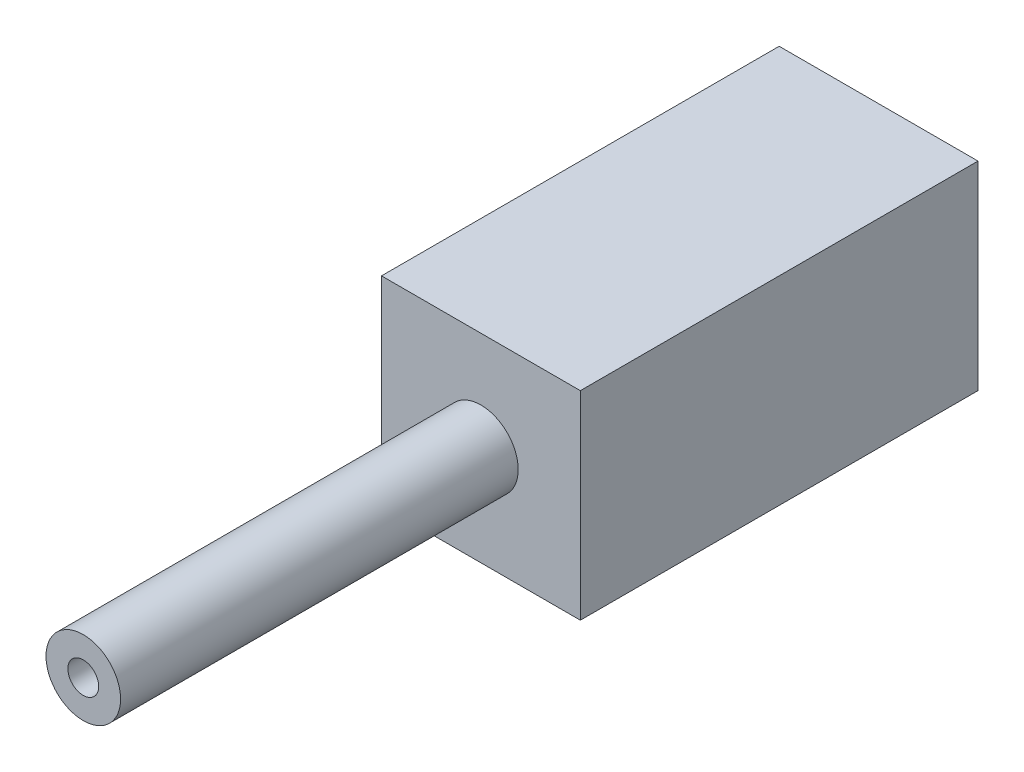
ISO-10303-21;
HEADER;
FILE_DESCRIPTION(('STEP AP214'),'2;1');
FILE_NAME('part.step','',(''),(''),'','','');
FILE_SCHEMA(('AUTOMOTIVE_DESIGN { 1 0 10303 214 1 1 1 1 }'));
ENDSEC;
DATA;
#1=APPLICATION_CONTEXT('core data for automotive mechanical design processes');
#2=APPLICATION_PROTOCOL_DEFINITION('international standard','automotive_design',2000,#1);
#3=PRODUCT_CONTEXT('',#1,'mechanical');
#4=PRODUCT('Part','Part','',(#3));
#5=PRODUCT_RELATED_PRODUCT_CATEGORY('part','',(#4));
#6=PRODUCT_DEFINITION_FORMATION('','',#4);
#7=PRODUCT_DEFINITION_CONTEXT('part definition',#1,'design');
#8=PRODUCT_DEFINITION('design','',#6,#7);
#9=PRODUCT_DEFINITION_SHAPE('','',#8);
#10=(LENGTH_UNIT() NAMED_UNIT(*) SI_UNIT(.MILLI.,.METRE.));
#11=(NAMED_UNIT(*) PLANE_ANGLE_UNIT() SI_UNIT($,.RADIAN.));
#12=(NAMED_UNIT(*) SI_UNIT($,.STERADIAN.) SOLID_ANGLE_UNIT());
#13=UNCERTAINTY_MEASURE_WITH_UNIT(LENGTH_MEASURE(1.E-05),#10,'distance_accuracy_value','');
#14=(GEOMETRIC_REPRESENTATION_CONTEXT(3) GLOBAL_UNCERTAINTY_ASSIGNED_CONTEXT((#13)) GLOBAL_UNIT_ASSIGNED_CONTEXT((#10,
#11,#12)) REPRESENTATION_CONTEXT('',''));
#15=CARTESIAN_POINT('',(0.,0.,0.));
#16=DIRECTION('',(0.,0.,1.));
#17=DIRECTION('',(1.,0.,0.));
#18=AXIS2_PLACEMENT_3D('',#15,#16,#17);
#19=CARTESIAN_POINT('',(0.,0.,40.));
#20=DIRECTION('',(0.,0.,-1.));
#21=DIRECTION('',(-1.,0.,0.));
#22=AXIS2_PLACEMENT_3D('',#19,#20,#21);
#23=PLANE('',#22);
#24=DIRECTION('',(0.,1.,0.));
#25=VECTOR('',#24,1.);
#26=CARTESIAN_POINT('',(10.,-10.,40.));
#27=LINE('',#26,#25);
#28=CARTESIAN_POINT('',(10.,-10.,40.));
#29=VERTEX_POINT('',#28);
#30=CARTESIAN_POINT('',(10.,10.,40.));
#31=VERTEX_POINT('',#30);
#32=EDGE_CURVE('E86',#29,#31,#27,.T.);
#33=ORIENTED_EDGE('',*,*,#32,.T.);
#34=DIRECTION('',(-1.,0.,0.));
#35=VECTOR('',#34,1.);
#36=CARTESIAN_POINT('',(-10.,10.,40.));
#37=LINE('',#36,#35);
#38=CARTESIAN_POINT('',(-10.,10.,40.));
#39=VERTEX_POINT('',#38);
#40=EDGE_CURVE('E81',#31,#39,#37,.T.);
#41=ORIENTED_EDGE('',*,*,#40,.T.);
#42=DIRECTION('',(0.,-1.,0.));
#43=VECTOR('',#42,1.);
#44=CARTESIAN_POINT('',(-10.,-10.,40.));
#45=LINE('',#44,#43);
#46=CARTESIAN_POINT('',(-10.,-10.,40.));
#47=VERTEX_POINT('',#46);
#48=EDGE_CURVE('E84',#39,#47,#45,.T.);
#49=ORIENTED_EDGE('',*,*,#48,.T.);
#50=DIRECTION('',(1.,0.,0.));
#51=VECTOR('',#50,1.);
#52=CARTESIAN_POINT('',(-10.,-10.,40.));
#53=LINE('',#52,#51);
#54=EDGE_CURVE('E50',#47,#29,#53,.T.);
#55=ORIENTED_EDGE('',*,*,#54,.T.);
#56=EDGE_LOOP('',(#33,#41,#49,#55));
#57=FACE_BOUND('',#56,.T.);
#58=CARTESIAN_POINT('',(0.,0.,40.));
#59=DIRECTION('',(0.,0.,-1.));
#60=DIRECTION('',(-1.,0.,0.));
#61=AXIS2_PLACEMENT_3D('',#58,#59,#60);
#62=CIRCLE('',#61,3.75);
#63=CARTESIAN_POINT('',(-3.75,0.,40.));
#64=VERTEX_POINT('',#63);
#65=EDGE_CURVE('E11',#64,#64,#62,.F.);
#66=ORIENTED_EDGE('',*,*,#65,.F.);
#67=EDGE_LOOP('',(#66));
#68=FACE_BOUND('',#67,.T.);
#69=ADVANCED_FACE('F33',(#57,#68),#23,.F.);
#70=CARTESIAN_POINT('',(0.,0.,0.));
#71=DIRECTION('',(0.,0.,-1.));
#72=DIRECTION('',(-1.,0.,0.));
#73=AXIS2_PLACEMENT_3D('',#70,#71,#72);
#74=PLANE('',#73);
#75=DIRECTION('',(0.,1.,0.));
#76=VECTOR('',#75,1.);
#77=CARTESIAN_POINT('',(10.,-10.,0.));
#78=LINE('',#77,#76);
#79=CARTESIAN_POINT('',(10.,-10.,0.));
#80=VERTEX_POINT('',#79);
#81=CARTESIAN_POINT('',(10.,10.,0.));
#82=VERTEX_POINT('',#81);
#83=EDGE_CURVE('E100',#80,#82,#78,.T.);
#84=ORIENTED_EDGE('',*,*,#83,.F.);
#85=DIRECTION('',(1.,0.,0.));
#86=VECTOR('',#85,1.);
#87=CARTESIAN_POINT('',(-10.,-10.,0.));
#88=LINE('',#87,#86);
#89=CARTESIAN_POINT('',(-10.,-10.,0.));
#90=VERTEX_POINT('',#89);
#91=EDGE_CURVE('E73',#90,#80,#88,.T.);
#92=ORIENTED_EDGE('',*,*,#91,.F.);
#93=DIRECTION('',(0.,-1.,0.));
#94=VECTOR('',#93,1.);
#95=CARTESIAN_POINT('',(-10.,-10.,0.));
#96=LINE('',#95,#94);
#97=CARTESIAN_POINT('',(-10.,10.,0.));
#98=VERTEX_POINT('',#97);
#99=EDGE_CURVE('E67',#98,#90,#96,.T.);
#100=ORIENTED_EDGE('',*,*,#99,.F.);
#101=DIRECTION('',(-1.,0.,0.));
#102=VECTOR('',#101,1.);
#103=CARTESIAN_POINT('',(-10.,10.,0.));
#104=LINE('',#103,#102);
#105=EDGE_CURVE('E91',#82,#98,#104,.T.);
#106=ORIENTED_EDGE('',*,*,#105,.F.);
#107=EDGE_LOOP('',(#84,#92,#100,#106));
#108=FACE_BOUND('',#107,.T.);
#109=CARTESIAN_POINT('',(0.,0.,0.));
#110=DIRECTION('',(0.,0.,1.));
#111=DIRECTION('',(1.,0.,0.));
#112=AXIS2_PLACEMENT_3D('',#109,#110,#111);
#113=CIRCLE('',#112,1.55);
#114=CARTESIAN_POINT('',(1.55,0.,0.));
#115=VERTEX_POINT('',#114);
#116=EDGE_CURVE('E103',#115,#115,#113,.T.);
#117=ORIENTED_EDGE('',*,*,#116,.T.);
#118=EDGE_LOOP('',(#117));
#119=FACE_BOUND('',#118,.T.);
#120=ADVANCED_FACE('F111',(#108,#119),#74,.T.);
#121=CARTESIAN_POINT('',(10.,-10.,40.));
#122=DIRECTION('',(-1.,0.,0.));
#123=DIRECTION('',(0.,0.,1.));
#124=AXIS2_PLACEMENT_3D('',#121,#122,#123);
#125=PLANE('',#124);
#126=ORIENTED_EDGE('',*,*,#83,.T.);
#127=DIRECTION('',(0.,0.,-1.));
#128=VECTOR('',#127,1.);
#129=CARTESIAN_POINT('',(10.,10.,40.));
#130=LINE('',#129,#128);
#131=EDGE_CURVE('E42',#31,#82,#130,.T.);
#132=ORIENTED_EDGE('',*,*,#131,.F.);
#133=ORIENTED_EDGE('',*,*,#32,.F.);
#134=DIRECTION('',(0.,0.,-1.));
#135=VECTOR('',#134,1.);
#136=CARTESIAN_POINT('',(10.,-10.,40.));
#137=LINE('',#136,#135);
#138=EDGE_CURVE('E96',#29,#80,#137,.T.);
#139=ORIENTED_EDGE('',*,*,#138,.T.);
#140=EDGE_LOOP('',(#126,#132,#133,#139));
#141=FACE_BOUND('',#140,.T.);
#142=ADVANCED_FACE('F35',(#141),#125,.F.);
#143=CARTESIAN_POINT('',(-10.,10.,40.));
#144=DIRECTION('',(0.,-1.,0.));
#145=DIRECTION('',(0.,0.,-1.));
#146=AXIS2_PLACEMENT_3D('',#143,#144,#145);
#147=PLANE('',#146);
#148=ORIENTED_EDGE('',*,*,#105,.T.);
#149=DIRECTION('',(0.,0.,-1.));
#150=VECTOR('',#149,1.);
#151=CARTESIAN_POINT('',(-10.,10.,40.));
#152=LINE('',#151,#150);
#153=EDGE_CURVE('E89',#39,#98,#152,.T.);
#154=ORIENTED_EDGE('',*,*,#153,.F.);
#155=ORIENTED_EDGE('',*,*,#40,.F.);
#156=ORIENTED_EDGE('',*,*,#131,.T.);
#157=EDGE_LOOP('',(#148,#154,#155,#156));
#158=FACE_BOUND('',#157,.T.);
#159=ADVANCED_FACE('F90',(#158),#147,.F.);
#160=CARTESIAN_POINT('',(-10.,-10.,40.));
#161=DIRECTION('',(1.,0.,0.));
#162=DIRECTION('',(0.,0.,-1.));
#163=AXIS2_PLACEMENT_3D('',#160,#161,#162);
#164=PLANE('',#163);
#165=ORIENTED_EDGE('',*,*,#99,.T.);
#166=DIRECTION('',(0.,0.,-1.));
#167=VECTOR('',#166,1.);
#168=CARTESIAN_POINT('',(-10.,-10.,40.));
#169=LINE('',#168,#167);
#170=EDGE_CURVE('E92',#47,#90,#169,.T.);
#171=ORIENTED_EDGE('',*,*,#170,.F.);
#172=ORIENTED_EDGE('',*,*,#48,.F.);
#173=ORIENTED_EDGE('',*,*,#153,.T.);
#174=EDGE_LOOP('',(#165,#171,#172,#173));
#175=FACE_BOUND('',#174,.T.);
#176=ADVANCED_FACE('F94',(#175),#164,.F.);
#177=CARTESIAN_POINT('',(-10.,-10.,40.));
#178=DIRECTION('',(0.,1.,0.));
#179=DIRECTION('',(0.,0.,1.));
#180=AXIS2_PLACEMENT_3D('',#177,#178,#179);
#181=PLANE('',#180);
#182=ORIENTED_EDGE('',*,*,#91,.T.);
#183=ORIENTED_EDGE('',*,*,#138,.F.);
#184=ORIENTED_EDGE('',*,*,#54,.F.);
#185=ORIENTED_EDGE('',*,*,#170,.T.);
#186=EDGE_LOOP('',(#182,#183,#184,#185));
#187=FACE_BOUND('',#186,.T.);
#188=ADVANCED_FACE('F133',(#187),#181,.F.);
#189=CARTESIAN_POINT('',(0.,0.,40.));
#190=DIRECTION('',(0.,0.,-1.));
#191=DIRECTION('',(-1.,0.,0.));
#192=AXIS2_PLACEMENT_3D('',#189,#190,#191);
#193=CYLINDRICAL_SURFACE('',#192,1.55);
#194=ORIENTED_EDGE('',*,*,#116,.F.);
#195=EDGE_LOOP('',(#194));
#196=FACE_BOUND('',#195,.T.);
#197=CARTESIAN_POINT('',(0.,0.,80.));
#198=DIRECTION('',(0.,0.,1.));
#199=DIRECTION('',(1.,0.,0.));
#200=AXIS2_PLACEMENT_3D('',#197,#198,#199);
#201=CIRCLE('',#200,1.55);
#202=CARTESIAN_POINT('',(1.55,0.,80.));
#203=VERTEX_POINT('',#202);
#204=EDGE_CURVE('E121',#203,#203,#201,.F.);
#205=ORIENTED_EDGE('',*,*,#204,.F.);
#206=EDGE_LOOP('',(#205));
#207=FACE_BOUND('',#206,.T.);
#208=ADVANCED_FACE('F130',(#196,#207),#193,.F.);
#209=CARTESIAN_POINT('',(0.,0.,80.));
#210=DIRECTION('',(0.,0.,-1.));
#211=DIRECTION('',(-1.,0.,0.));
#212=AXIS2_PLACEMENT_3D('',#209,#210,#211);
#213=CYLINDRICAL_SURFACE('',#212,3.75);
#214=CARTESIAN_POINT('',(0.,0.,80.));
#215=DIRECTION('',(0.,0.,1.));
#216=DIRECTION('',(1.,0.,0.));
#217=AXIS2_PLACEMENT_3D('',#214,#215,#216);
#218=CIRCLE('',#217,3.75);
#219=CARTESIAN_POINT('',(3.75,0.,80.));
#220=VERTEX_POINT('',#219);
#221=EDGE_CURVE('E118',#220,#220,#218,.T.);
#222=ORIENTED_EDGE('',*,*,#221,.F.);
#223=EDGE_LOOP('',(#222));
#224=FACE_BOUND('',#223,.T.);
#225=ORIENTED_EDGE('',*,*,#65,.T.);
#226=EDGE_LOOP('',(#225));
#227=FACE_BOUND('',#226,.T.);
#228=ADVANCED_FACE('F132',(#224,#227),#213,.T.);
#229=CARTESIAN_POINT('',(0.,0.,80.));
#230=DIRECTION('',(0.,0.,1.));
#231=DIRECTION('',(1.,0.,0.));
#232=AXIS2_PLACEMENT_3D('',#229,#230,#231);
#233=PLANE('',#232);
#234=ORIENTED_EDGE('',*,*,#204,.T.);
#235=EDGE_LOOP('',(#234));
#236=FACE_BOUND('',#235,.T.);
#237=ORIENTED_EDGE('',*,*,#221,.T.);
#238=EDGE_LOOP('',(#237));
#239=FACE_BOUND('',#238,.T.);
#240=ADVANCED_FACE('F127',(#236,#239),#233,.T.);
#241=CLOSED_SHELL('',(#69,#120,#142,#159,#176,#188,#208,#228,#240));
#242=MANIFOLD_SOLID_BREP('B2',#241);
#243=ADVANCED_BREP_SHAPE_REPRESENTATION('',(#18,#242),#14);
#244=SHAPE_DEFINITION_REPRESENTATION(#9,#243);
ENDSEC;
END-ISO-10303-21;
